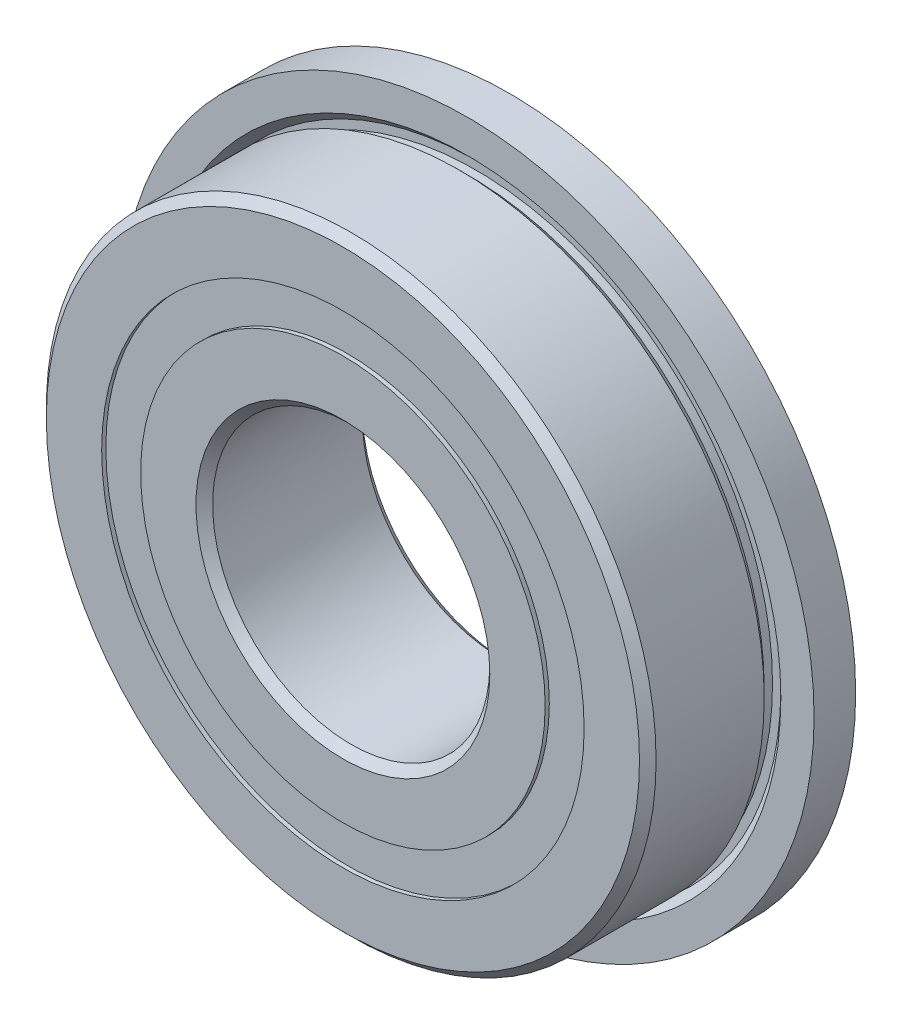
ISO-10303-21;
HEADER;
FILE_DESCRIPTION(('STEP AP214'),'2;1');
FILE_NAME('part.step','',(''),(''),'','','');
FILE_SCHEMA(('AUTOMOTIVE_DESIGN { 1 0 10303 214 1 1 1 1 }'));
ENDSEC;
DATA;
#1=APPLICATION_CONTEXT('core data for automotive mechanical design processes');
#2=APPLICATION_PROTOCOL_DEFINITION('international standard','automotive_design',2000,#1);
#3=PRODUCT_CONTEXT('',#1,'mechanical');
#4=PRODUCT('Part','Part','',(#3));
#5=PRODUCT_RELATED_PRODUCT_CATEGORY('part','',(#4));
#6=PRODUCT_DEFINITION_FORMATION('','',#4);
#7=PRODUCT_DEFINITION_CONTEXT('part definition',#1,'design');
#8=PRODUCT_DEFINITION('design','',#6,#7);
#9=PRODUCT_DEFINITION_SHAPE('','',#8);
#10=(LENGTH_UNIT() NAMED_UNIT(*) SI_UNIT(.MILLI.,.METRE.));
#11=(NAMED_UNIT(*) PLANE_ANGLE_UNIT() SI_UNIT($,.RADIAN.));
#12=(NAMED_UNIT(*) SI_UNIT($,.STERADIAN.) SOLID_ANGLE_UNIT());
#13=UNCERTAINTY_MEASURE_WITH_UNIT(LENGTH_MEASURE(1.E-05),#10,'distance_accuracy_value','');
#14=(GEOMETRIC_REPRESENTATION_CONTEXT(3) GLOBAL_UNCERTAINTY_ASSIGNED_CONTEXT((#13)) GLOBAL_UNIT_ASSIGNED_CONTEXT((#10,
#11,#12)) REPRESENTATION_CONTEXT('',''));
#15=CARTESIAN_POINT('',(0.,0.,0.));
#16=DIRECTION('',(0.,0.,1.));
#17=DIRECTION('',(1.,0.,0.));
#18=AXIS2_PLACEMENT_3D('',#15,#16,#17);
#19=CARTESIAN_POINT('',(0.,8.7032967032967,-2.85000000000001));
#20=DIRECTION('',(0.,0.,1.));
#21=DIRECTION('',(1.,0.,0.));
#22=AXIS2_PLACEMENT_3D('',#19,#20,#21);
#23=PLANE('',#22);
#24=CARTESIAN_POINT('',(0.,0.,-2.85000000000001));
#25=DIRECTION('',(0.,0.,1.));
#26=DIRECTION('',(1.,0.,0.));
#27=AXIS2_PLACEMENT_3D('',#24,#25,#26);
#28=CIRCLE('',#27,8.7032967032967);
#29=CARTESIAN_POINT('',(8.7032967032967,0.,-2.85000000000001));
#30=VERTEX_POINT('',#29);
#31=EDGE_CURVE('E55',#30,#30,#28,.T.);
#32=ORIENTED_EDGE('',*,*,#31,.F.);
#33=EDGE_LOOP('',(#32));
#34=FACE_BOUND('',#33,.T.);
#35=CARTESIAN_POINT('',(0.,0.,-2.85000000000001));
#36=DIRECTION('',(0.,0.,1.));
#37=DIRECTION('',(1.,0.,0.));
#38=AXIS2_PLACEMENT_3D('',#35,#36,#37);
#39=CIRCLE('',#38,7.2967032967033);
#40=CARTESIAN_POINT('',(7.2967032967033,0.,-2.85000000000001));
#41=VERTEX_POINT('',#40);
#42=EDGE_CURVE('E11',#41,#41,#39,.T.);
#43=ORIENTED_EDGE('',*,*,#42,.T.);
#44=EDGE_LOOP('',(#43));
#45=FACE_BOUND('',#44,.T.);
#46=ADVANCED_FACE('F41',(#34,#45),#23,.F.);
#47=CARTESIAN_POINT('',(0.,0.,3.));
#48=DIRECTION('',(0.,0.,1.));
#49=DIRECTION('',(1.,0.,0.));
#50=AXIS2_PLACEMENT_3D('',#47,#48,#49);
#51=CYLINDRICAL_SURFACE('',#50,7.2967032967033);
#52=ORIENTED_EDGE('',*,*,#42,.F.);
#53=EDGE_LOOP('',(#52));
#54=FACE_BOUND('',#53,.T.);
#55=CARTESIAN_POINT('',(0.,0.,-1.50744951180655));
#56=DIRECTION('',(0.,0.,1.));
#57=DIRECTION('',(1.,0.,0.));
#58=AXIS2_PLACEMENT_3D('',#55,#56,#57);
#59=CIRCLE('',#58,7.2967032967033);
#60=CARTESIAN_POINT('',(7.2967032967033,0.,-1.50744951180655));
#61=VERTEX_POINT('',#60);
#62=EDGE_CURVE('E47',#61,#61,#59,.T.);
#63=ORIENTED_EDGE('',*,*,#62,.T.);
#64=EDGE_LOOP('',(#63));
#65=FACE_BOUND('',#64,.T.);
#66=ADVANCED_FACE('F64',(#54,#65),#51,.F.);
#67=CARTESIAN_POINT('',(0.,8.7032967032967,-1.50744951180654));
#68=DIRECTION('',(0.,0.,-1.));
#69=DIRECTION('',(-1.,0.,0.));
#70=AXIS2_PLACEMENT_3D('',#67,#68,#69);
#71=PLANE('',#70);
#72=ORIENTED_EDGE('',*,*,#62,.F.);
#73=EDGE_LOOP('',(#72));
#74=FACE_BOUND('',#73,.T.);
#75=CARTESIAN_POINT('',(0.,0.,-1.50744951180654));
#76=DIRECTION('',(0.,0.,1.));
#77=DIRECTION('',(1.,0.,0.));
#78=AXIS2_PLACEMENT_3D('',#75,#76,#77);
#79=CIRCLE('',#78,8.7032967032967);
#80=CARTESIAN_POINT('',(8.7032967032967,0.,-1.50744951180654));
#81=VERTEX_POINT('',#80);
#82=EDGE_CURVE('E51',#81,#81,#79,.T.);
#83=ORIENTED_EDGE('',*,*,#82,.T.);
#84=EDGE_LOOP('',(#83));
#85=FACE_BOUND('',#84,.T.);
#86=ADVANCED_FACE('F68',(#74,#85),#71,.F.);
#87=CARTESIAN_POINT('',(0.,0.,3.));
#88=DIRECTION('',(0.,0.,1.));
#89=DIRECTION('',(1.,0.,0.));
#90=AXIS2_PLACEMENT_3D('',#87,#88,#89);
#91=CYLINDRICAL_SURFACE('',#90,8.7032967032967);
#92=ORIENTED_EDGE('',*,*,#82,.F.);
#93=EDGE_LOOP('',(#92));
#94=FACE_BOUND('',#93,.T.);
#95=ORIENTED_EDGE('',*,*,#31,.T.);
#96=EDGE_LOOP('',(#95));
#97=FACE_BOUND('',#96,.T.);
#98=ADVANCED_FACE('F61',(#94,#97),#91,.T.);
#99=CLOSED_SHELL('',(#46,#66,#86,#98));
#100=MANIFOLD_SOLID_BREP('B2',#99);
#101=CARTESIAN_POINT('',(0.,8.7032967032967,2.85000000000001));
#102=DIRECTION('',(0.,0.,-1.));
#103=DIRECTION('',(-1.,0.,0.));
#104=AXIS2_PLACEMENT_3D('',#101,#102,#103);
#105=PLANE('',#104);
#106=CARTESIAN_POINT('',(0.,0.,2.85000000000001));
#107=DIRECTION('',(0.,0.,1.));
#108=DIRECTION('',(1.,0.,0.));
#109=AXIS2_PLACEMENT_3D('',#106,#107,#108);
#110=CIRCLE('',#109,7.2967032967033);
#111=CARTESIAN_POINT('',(7.2967032967033,0.,2.85000000000001));
#112=VERTEX_POINT('',#111);
#113=EDGE_CURVE('E40',#112,#112,#110,.T.);
#114=ORIENTED_EDGE('',*,*,#113,.F.);
#115=EDGE_LOOP('',(#114));
#116=FACE_BOUND('',#115,.T.);
#117=CARTESIAN_POINT('',(0.,0.,2.85000000000001));
#118=DIRECTION('',(0.,0.,1.));
#119=DIRECTION('',(1.,0.,0.));
#120=AXIS2_PLACEMENT_3D('',#117,#118,#119);
#121=CIRCLE('',#120,8.7032967032967);
#122=CARTESIAN_POINT('',(8.7032967032967,0.,2.85000000000001));
#123=VERTEX_POINT('',#122);
#124=EDGE_CURVE('E122',#123,#123,#121,.T.);
#125=ORIENTED_EDGE('',*,*,#124,.T.);
#126=EDGE_LOOP('',(#125));
#127=FACE_BOUND('',#126,.T.);
#128=ADVANCED_FACE('F108',(#116,#127),#105,.F.);
#129=CARTESIAN_POINT('',(0.,0.,3.));
#130=DIRECTION('',(0.,0.,1.));
#131=DIRECTION('',(1.,0.,0.));
#132=AXIS2_PLACEMENT_3D('',#129,#130,#131);
#133=CYLINDRICAL_SURFACE('',#132,7.2967032967033);
#134=CARTESIAN_POINT('',(0.,0.,1.50744951180654));
#135=DIRECTION('',(0.,0.,1.));
#136=DIRECTION('',(1.,0.,0.));
#137=AXIS2_PLACEMENT_3D('',#134,#135,#136);
#138=CIRCLE('',#137,7.2967032967033);
#139=CARTESIAN_POINT('',(7.2967032967033,0.,1.50744951180654));
#140=VERTEX_POINT('',#139);
#141=EDGE_CURVE('E114',#140,#140,#138,.T.);
#142=ORIENTED_EDGE('',*,*,#141,.F.);
#143=EDGE_LOOP('',(#142));
#144=FACE_BOUND('',#143,.T.);
#145=ORIENTED_EDGE('',*,*,#113,.T.);
#146=EDGE_LOOP('',(#145));
#147=FACE_BOUND('',#146,.T.);
#148=ADVANCED_FACE('F137',(#144,#147),#133,.F.);
#149=CARTESIAN_POINT('',(0.,8.7032967032967,1.50744951180654));
#150=DIRECTION('',(0.,0.,1.));
#151=DIRECTION('',(1.,0.,0.));
#152=AXIS2_PLACEMENT_3D('',#149,#150,#151);
#153=PLANE('',#152);
#154=CARTESIAN_POINT('',(0.,0.,1.50744951180654));
#155=DIRECTION('',(0.,0.,1.));
#156=DIRECTION('',(1.,0.,0.));
#157=AXIS2_PLACEMENT_3D('',#154,#155,#156);
#158=CIRCLE('',#157,8.7032967032967);
#159=CARTESIAN_POINT('',(8.7032967032967,0.,1.50744951180654));
#160=VERTEX_POINT('',#159);
#161=EDGE_CURVE('E118',#160,#160,#158,.T.);
#162=ORIENTED_EDGE('',*,*,#161,.F.);
#163=EDGE_LOOP('',(#162));
#164=FACE_BOUND('',#163,.T.);
#165=ORIENTED_EDGE('',*,*,#141,.T.);
#166=EDGE_LOOP('',(#165));
#167=FACE_BOUND('',#166,.T.);
#168=ADVANCED_FACE('F132',(#164,#167),#153,.F.);
#169=CARTESIAN_POINT('',(0.,0.,3.));
#170=DIRECTION('',(0.,0.,1.));
#171=DIRECTION('',(1.,0.,0.));
#172=AXIS2_PLACEMENT_3D('',#169,#170,#171);
#173=CYLINDRICAL_SURFACE('',#172,8.7032967032967);
#174=ORIENTED_EDGE('',*,*,#124,.F.);
#175=EDGE_LOOP('',(#174));
#176=FACE_BOUND('',#175,.T.);
#177=ORIENTED_EDGE('',*,*,#161,.T.);
#178=EDGE_LOOP('',(#177));
#179=FACE_BOUND('',#178,.T.);
#180=ADVANCED_FACE('F129',(#176,#179),#173,.T.);
#181=CLOSED_SHELL('',(#128,#148,#168,#180));
#182=MANIFOLD_SOLID_BREP('B6',#181);
#183=CARTESIAN_POINT('',(0.,8.,0.));
#184=DIRECTION('',(0.,0.,1.));
#185=DIRECTION('',(0.,1.,0.));
#186=AXIS2_PLACEMENT_3D('',#183,#184,#185);
#187=SPHERICAL_SURFACE('',#186,1.50744951180654);
#188=CARTESIAN_POINT('',(0.,8.,1.50744951180654));
#189=VERTEX_POINT('',#188);
#190=VERTEX_LOOP('',#189);
#191=FACE_BOUND('',#190,.T.);
#192=ADVANCED_FACE('F177',(#191),#187,.T.);
#193=CLOSED_SHELL('',(#192));
#194=MANIFOLD_SOLID_BREP('B35',#193);
#195=CARTESIAN_POINT('',(0.,8.35164835164835,0.117216117216116));
#196=DIRECTION('',(0.,0.,-1.));
#197=DIRECTION('',(-1.,0.,0.));
#198=AXIS2_PLACEMENT_3D('',#195,#196,#197);
#199=PLANE('',#198);
#200=CARTESIAN_POINT('',(0.,0.,0.117216117216116));
#201=DIRECTION('',(0.,0.,1.));
#202=DIRECTION('',(1.,0.,0.));
#203=AXIS2_PLACEMENT_3D('',#200,#201,#202);
#204=CIRCLE('',#203,7.64835164835165);
#205=CARTESIAN_POINT('',(7.64835164835165,0.,0.117216117216116));
#206=VERTEX_POINT('',#205);
#207=EDGE_CURVE('E176',#206,#206,#204,.T.);
#208=ORIENTED_EDGE('',*,*,#207,.F.);
#209=EDGE_LOOP('',(#208));
#210=FACE_BOUND('',#209,.T.);
#211=CARTESIAN_POINT('',(0.,0.,0.117216117216116));
#212=DIRECTION('',(0.,0.,1.));
#213=DIRECTION('',(1.,0.,0.));
#214=AXIS2_PLACEMENT_3D('',#211,#212,#213);
#215=CIRCLE('',#214,8.35164835164835);
#216=CARTESIAN_POINT('',(8.35164835164835,0.,0.117216117216116));
#217=VERTEX_POINT('',#216);
#218=EDGE_CURVE('E211',#217,#217,#215,.T.);
#219=ORIENTED_EDGE('',*,*,#218,.T.);
#220=EDGE_LOOP('',(#219));
#221=FACE_BOUND('',#220,.T.);
#222=ADVANCED_FACE('F197',(#210,#221),#199,.F.);
#223=CARTESIAN_POINT('',(0.,0.,3.));
#224=DIRECTION('',(0.,0.,1.));
#225=DIRECTION('',(1.,0.,0.));
#226=AXIS2_PLACEMENT_3D('',#223,#224,#225);
#227=CYLINDRICAL_SURFACE('',#226,7.64835164835165);
#228=CARTESIAN_POINT('',(0.,0.,-0.117216117216118));
#229=DIRECTION('',(0.,0.,1.));
#230=DIRECTION('',(1.,0.,0.));
#231=AXIS2_PLACEMENT_3D('',#228,#229,#230);
#232=CIRCLE('',#231,7.64835164835165);
#233=CARTESIAN_POINT('',(7.64835164835165,0.,-0.117216117216118));
#234=VERTEX_POINT('',#233);
#235=EDGE_CURVE('E203',#234,#234,#232,.T.);
#236=ORIENTED_EDGE('',*,*,#235,.F.);
#237=EDGE_LOOP('',(#236));
#238=FACE_BOUND('',#237,.T.);
#239=ORIENTED_EDGE('',*,*,#207,.T.);
#240=EDGE_LOOP('',(#239));
#241=FACE_BOUND('',#240,.T.);
#242=ADVANCED_FACE('F226',(#238,#241),#227,.F.);
#243=CARTESIAN_POINT('',(0.,8.35164835164835,-0.117216117216118));
#244=DIRECTION('',(0.,0.,1.));
#245=DIRECTION('',(1.,0.,0.));
#246=AXIS2_PLACEMENT_3D('',#243,#244,#245);
#247=PLANE('',#246);
#248=CARTESIAN_POINT('',(0.,0.,-0.117216117216118));
#249=DIRECTION('',(0.,0.,1.));
#250=DIRECTION('',(1.,0.,0.));
#251=AXIS2_PLACEMENT_3D('',#248,#249,#250);
#252=CIRCLE('',#251,8.35164835164835);
#253=CARTESIAN_POINT('',(8.35164835164835,0.,-0.117216117216118));
#254=VERTEX_POINT('',#253);
#255=EDGE_CURVE('E207',#254,#254,#252,.T.);
#256=ORIENTED_EDGE('',*,*,#255,.F.);
#257=EDGE_LOOP('',(#256));
#258=FACE_BOUND('',#257,.T.);
#259=ORIENTED_EDGE('',*,*,#235,.T.);
#260=EDGE_LOOP('',(#259));
#261=FACE_BOUND('',#260,.T.);
#262=ADVANCED_FACE('F221',(#258,#261),#247,.F.);
#263=CARTESIAN_POINT('',(0.,0.,3.));
#264=DIRECTION('',(0.,0.,1.));
#265=DIRECTION('',(1.,0.,0.));
#266=AXIS2_PLACEMENT_3D('',#263,#264,#265);
#267=CYLINDRICAL_SURFACE('',#266,8.35164835164835);
#268=ORIENTED_EDGE('',*,*,#218,.F.);
#269=EDGE_LOOP('',(#268));
#270=FACE_BOUND('',#269,.T.);
#271=ORIENTED_EDGE('',*,*,#255,.T.);
#272=EDGE_LOOP('',(#271));
#273=FACE_BOUND('',#272,.T.);
#274=ADVANCED_FACE('F218',(#270,#273),#267,.T.);
#275=CLOSED_SHELL('',(#222,#242,#262,#274));
#276=MANIFOLD_SOLID_BREP('B104',#275);
#277=CARTESIAN_POINT('',(0.,7.2967032967033,3.));
#278=DIRECTION('',(0.,0.,-1.));
#279=DIRECTION('',(-1.,0.,0.));
#280=AXIS2_PLACEMENT_3D('',#277,#278,#279);
#281=PLANE('',#280);
#282=CARTESIAN_POINT('',(0.,0.,3.));
#283=DIRECTION('',(0.,0.,1.));
#284=DIRECTION('',(1.,0.,0.));
#285=AXIS2_PLACEMENT_3D('',#282,#283,#284);
#286=CIRCLE('',#285,5.29999999999998);
#287=CARTESIAN_POINT('',(5.29999999999998,0.,3.));
#288=VERTEX_POINT('',#287);
#289=EDGE_CURVE('E293',#288,#288,#286,.T.);
#290=ORIENTED_EDGE('',*,*,#289,.F.);
#291=EDGE_LOOP('',(#290));
#292=FACE_BOUND('',#291,.T.);
#293=CARTESIAN_POINT('',(0.,0.,3.));
#294=DIRECTION('',(0.,0.,1.));
#295=DIRECTION('',(1.,0.,0.));
#296=AXIS2_PLACEMENT_3D('',#293,#294,#295);
#297=CIRCLE('',#296,7.2967032967033);
#298=CARTESIAN_POINT('',(7.2967032967033,0.,3.));
#299=VERTEX_POINT('',#298);
#300=EDGE_CURVE('E196',#299,#299,#297,.T.);
#301=ORIENTED_EDGE('',*,*,#300,.T.);
#302=EDGE_LOOP('',(#301));
#303=FACE_BOUND('',#302,.T.);
#304=ADVANCED_FACE('F265',(#292,#303),#281,.F.);
#305=CARTESIAN_POINT('',(0.,0.,3.));
#306=DIRECTION('',(0.,0.,1.));
#307=DIRECTION('',(1.,0.,0.));
#308=AXIS2_PLACEMENT_3D('',#305,#306,#307);
#309=CYLINDRICAL_SURFACE('',#308,7.2967032967033);
#310=ORIENTED_EDGE('',*,*,#300,.F.);
#311=EDGE_LOOP('',(#310));
#312=FACE_BOUND('',#311,.T.);
#313=CARTESIAN_POINT('',(0.,0.,1.33333333333333));
#314=DIRECTION('',(0.,0.,1.));
#315=DIRECTION('',(1.,0.,0.));
#316=AXIS2_PLACEMENT_3D('',#313,#314,#315);
#317=CIRCLE('',#316,7.2967032967033);
#318=CARTESIAN_POINT('',(7.2967032967033,0.,1.33333333333333));
#319=VERTEX_POINT('',#318);
#320=EDGE_CURVE('E271',#319,#319,#317,.T.);
#321=ORIENTED_EDGE('',*,*,#320,.T.);
#322=EDGE_LOOP('',(#321));
#323=FACE_BOUND('',#322,.T.);
#324=ADVANCED_FACE('F300',(#312,#323),#309,.T.);
#325=CARTESIAN_POINT('',(0.,0.,0.));
#326=DIRECTION('',(0.,0.,1.));
#327=DIRECTION('',(1.,0.,0.));
#328=AXIS2_PLACEMENT_3D('',#325,#326,#327);
#329=TOROIDAL_SURFACE('',#328,8.,1.50744951180654);
#330=ORIENTED_EDGE('',*,*,#320,.F.);
#331=EDGE_LOOP('',(#330));
#332=FACE_BOUND('',#331,.T.);
#333=CARTESIAN_POINT('',(0.,0.,-1.33333333333333));
#334=DIRECTION('',(0.,0.,1.));
#335=DIRECTION('',(1.,0.,0.));
#336=AXIS2_PLACEMENT_3D('',#333,#334,#335);
#337=CIRCLE('',#336,7.2967032967033);
#338=CARTESIAN_POINT('',(7.2967032967033,0.,-1.33333333333333));
#339=VERTEX_POINT('',#338);
#340=EDGE_CURVE('E275',#339,#339,#337,.T.);
#341=ORIENTED_EDGE('',*,*,#340,.T.);
#342=EDGE_LOOP('',(#341));
#343=FACE_BOUND('',#342,.T.);
#344=ADVANCED_FACE('F304',(#332,#343),#329,.F.);
#345=CARTESIAN_POINT('',(0.,0.,3.));
#346=DIRECTION('',(0.,0.,1.));
#347=DIRECTION('',(1.,0.,0.));
#348=AXIS2_PLACEMENT_3D('',#345,#346,#347);
#349=CYLINDRICAL_SURFACE('',#348,7.2967032967033);
#350=ORIENTED_EDGE('',*,*,#340,.F.);
#351=EDGE_LOOP('',(#350));
#352=FACE_BOUND('',#351,.T.);
#353=CARTESIAN_POINT('',(0.,0.,-3.));
#354=DIRECTION('',(0.,0.,1.));
#355=DIRECTION('',(1.,0.,0.));
#356=AXIS2_PLACEMENT_3D('',#353,#354,#355);
#357=CIRCLE('',#356,7.2967032967033);
#358=CARTESIAN_POINT('',(7.2967032967033,0.,-3.));
#359=VERTEX_POINT('',#358);
#360=EDGE_CURVE('E279',#359,#359,#357,.T.);
#361=ORIENTED_EDGE('',*,*,#360,.T.);
#362=EDGE_LOOP('',(#361));
#363=FACE_BOUND('',#362,.T.);
#364=ADVANCED_FACE('F309',(#352,#363),#349,.T.);
#365=CARTESIAN_POINT('',(0.,5.29999999999998,-3.));
#366=DIRECTION('',(0.,0.,1.));
#367=DIRECTION('',(1.,0.,0.));
#368=AXIS2_PLACEMENT_3D('',#365,#366,#367);
#369=PLANE('',#368);
#370=ORIENTED_EDGE('',*,*,#360,.F.);
#371=EDGE_LOOP('',(#370));
#372=FACE_BOUND('',#371,.T.);
#373=CARTESIAN_POINT('',(0.,0.,-3.));
#374=DIRECTION('',(0.,0.,1.));
#375=DIRECTION('',(1.,0.,0.));
#376=AXIS2_PLACEMENT_3D('',#373,#374,#375);
#377=CIRCLE('',#376,5.29999999999998);
#378=CARTESIAN_POINT('',(5.29999999999998,0.,-3.));
#379=VERTEX_POINT('',#378);
#380=EDGE_CURVE('E284',#379,#379,#377,.T.);
#381=ORIENTED_EDGE('',*,*,#380,.T.);
#382=EDGE_LOOP('',(#381));
#383=FACE_BOUND('',#382,.T.);
#384=ADVANCED_FACE('F315',(#372,#383),#369,.F.);
#385=CARTESIAN_POINT('',(0.,0.,-2.70000000000002));
#386=DIRECTION('',(0.,0.,-1.));
#387=DIRECTION('',(-1.,0.,0.));
#388=AXIS2_PLACEMENT_3D('',#385,#386,#387);
#389=CONICAL_SURFACE('',#388,5.,0.785398163397453);
#390=ORIENTED_EDGE('',*,*,#380,.F.);
#391=EDGE_LOOP('',(#390));
#392=FACE_BOUND('',#391,.T.);
#393=CARTESIAN_POINT('',(0.,0.,-2.70000000000002));
#394=DIRECTION('',(0.,0.,1.));
#395=DIRECTION('',(1.,0.,0.));
#396=AXIS2_PLACEMENT_3D('',#393,#394,#395);
#397=CIRCLE('',#396,5.);
#398=CARTESIAN_POINT('',(5.,0.,-2.70000000000002));
#399=VERTEX_POINT('',#398);
#400=EDGE_CURVE('E287',#399,#399,#397,.T.);
#401=ORIENTED_EDGE('',*,*,#400,.T.);
#402=EDGE_LOOP('',(#401));
#403=FACE_BOUND('',#402,.T.);
#404=ADVANCED_FACE('F319',(#392,#403),#389,.F.);
#405=CARTESIAN_POINT('',(0.,0.,3.));
#406=DIRECTION('',(0.,0.,1.));
#407=DIRECTION('',(1.,0.,0.));
#408=AXIS2_PLACEMENT_3D('',#405,#406,#407);
#409=CYLINDRICAL_SURFACE('',#408,5.);
#410=ORIENTED_EDGE('',*,*,#400,.F.);
#411=EDGE_LOOP('',(#410));
#412=FACE_BOUND('',#411,.T.);
#413=CARTESIAN_POINT('',(0.,0.,2.70000000000002));
#414=DIRECTION('',(0.,0.,1.));
#415=DIRECTION('',(1.,0.,0.));
#416=AXIS2_PLACEMENT_3D('',#413,#414,#415);
#417=CIRCLE('',#416,5.);
#418=CARTESIAN_POINT('',(5.,0.,2.70000000000002));
#419=VERTEX_POINT('',#418);
#420=EDGE_CURVE('E290',#419,#419,#417,.T.);
#421=ORIENTED_EDGE('',*,*,#420,.T.);
#422=EDGE_LOOP('',(#421));
#423=FACE_BOUND('',#422,.T.);
#424=ADVANCED_FACE('F323',(#412,#423),#409,.F.);
#425=CARTESIAN_POINT('',(0.,0.,3.));
#426=DIRECTION('',(0.,0.,1.));
#427=DIRECTION('',(1.,0.,0.));
#428=AXIS2_PLACEMENT_3D('',#425,#426,#427);
#429=CONICAL_SURFACE('',#428,5.29999999999998,0.785398163397445);
#430=ORIENTED_EDGE('',*,*,#420,.F.);
#431=EDGE_LOOP('',(#430));
#432=FACE_BOUND('',#431,.T.);
#433=ORIENTED_EDGE('',*,*,#289,.T.);
#434=EDGE_LOOP('',(#433));
#435=FACE_BOUND('',#434,.T.);
#436=ADVANCED_FACE('F297',(#432,#435),#429,.F.);
#437=CLOSED_SHELL('',(#304,#324,#344,#364,#384,#404,#424,#436));
#438=MANIFOLD_SOLID_BREP('B171',#437);
#439=CARTESIAN_POINT('',(0.,0.,3.));
#440=DIRECTION('',(0.,0.,1.));
#441=DIRECTION('',(1.,0.,0.));
#442=AXIS2_PLACEMENT_3D('',#439,#440,#441);
#443=CYLINDRICAL_SURFACE('',#442,12.5);
#444=CARTESIAN_POINT('',(0.,0.,-1.5));
#445=DIRECTION('',(0.,0.,1.));
#446=DIRECTION('',(1.,0.,0.));
#447=AXIS2_PLACEMENT_3D('',#444,#445,#446);
#448=CIRCLE('',#447,12.5);
#449=CARTESIAN_POINT('',(12.5,0.,-1.5));
#450=VERTEX_POINT('',#449);
#451=EDGE_CURVE('E392',#450,#450,#448,.T.);
#452=ORIENTED_EDGE('',*,*,#451,.F.);
#453=EDGE_LOOP('',(#452));
#454=FACE_BOUND('',#453,.T.);
#455=CARTESIAN_POINT('',(0.,0.,-2.99999999999999));
#456=DIRECTION('',(0.,0.,1.));
#457=DIRECTION('',(1.,0.,0.));
#458=AXIS2_PLACEMENT_3D('',#455,#456,#457);
#459=CIRCLE('',#458,12.5);
#460=CARTESIAN_POINT('',(12.5,0.,-2.99999999999999));
#461=VERTEX_POINT('',#460);
#462=EDGE_CURVE('E264',#461,#461,#459,.T.);
#463=ORIENTED_EDGE('',*,*,#462,.T.);
#464=EDGE_LOOP('',(#463));
#465=FACE_BOUND('',#464,.T.);
#466=ADVANCED_FACE('F386',(#454,#465),#443,.T.);
#467=CARTESIAN_POINT('',(0.,12.5,-1.5));
#468=DIRECTION('',(0.,0.,-1.));
#469=DIRECTION('',(-1.,0.,0.));
#470=AXIS2_PLACEMENT_3D('',#467,#468,#469);
#471=PLANE('',#470);
#472=CARTESIAN_POINT('',(0.,0.,-1.5));
#473=DIRECTION('',(0.,0.,1.));
#474=DIRECTION('',(1.,0.,0.));
#475=AXIS2_PLACEMENT_3D('',#472,#473,#474);
#476=CIRCLE('',#475,11.3);
#477=CARTESIAN_POINT('',(11.3,0.,-1.5));
#478=VERTEX_POINT('',#477);
#479=EDGE_CURVE('E396',#478,#478,#476,.T.);
#480=ORIENTED_EDGE('',*,*,#479,.F.);
#481=EDGE_LOOP('',(#480));
#482=FACE_BOUND('',#481,.T.);
#483=ORIENTED_EDGE('',*,*,#451,.T.);
#484=EDGE_LOOP('',(#483));
#485=FACE_BOUND('',#484,.T.);
#486=ADVANCED_FACE('F492',(#482,#485),#471,.F.);
#487=CARTESIAN_POINT('',(0.,0.,-1.5));
#488=DIRECTION('',(0.,0.,1.));
#489=DIRECTION('',(1.,0.,0.));
#490=AXIS2_PLACEMENT_3D('',#487,#488,#489);
#491=CONICAL_SURFACE('',#490,11.3,0.785398163397437);
#492=CARTESIAN_POINT('',(0.,0.,-1.79999999999998));
#493=DIRECTION('',(0.,0.,1.));
#494=DIRECTION('',(1.,0.,0.));
#495=AXIS2_PLACEMENT_3D('',#492,#493,#494);
#496=CIRCLE('',#495,11.);
#497=CARTESIAN_POINT('',(11.,0.,-1.79999999999998));
#498=VERTEX_POINT('',#497);
#499=EDGE_CURVE('E400',#498,#498,#496,.T.);
#500=ORIENTED_EDGE('',*,*,#499,.F.);
#501=EDGE_LOOP('',(#500));
#502=FACE_BOUND('',#501,.T.);
#503=ORIENTED_EDGE('',*,*,#479,.T.);
#504=EDGE_LOOP('',(#503));
#505=FACE_BOUND('',#504,.T.);
#506=ADVANCED_FACE('F486',(#502,#505),#491,.F.);
#507=CARTESIAN_POINT('',(0.,11.,-1.79999999999998));
#508=DIRECTION('',(0.,0.,-1.));
#509=DIRECTION('',(-1.,0.,0.));
#510=AXIS2_PLACEMENT_3D('',#507,#508,#509);
#511=PLANE('',#510);
#512=CARTESIAN_POINT('',(0.,0.,-1.79999999999998));
#513=DIRECTION('',(0.,0.,1.));
#514=DIRECTION('',(1.,0.,0.));
#515=AXIS2_PLACEMENT_3D('',#512,#513,#514);
#516=CIRCLE('',#515,10.7);
#517=CARTESIAN_POINT('',(10.7,0.,-1.79999999999998));
#518=VERTEX_POINT('',#517);
#519=EDGE_CURVE('E405',#518,#518,#516,.T.);
#520=ORIENTED_EDGE('',*,*,#519,.F.);
#521=EDGE_LOOP('',(#520));
#522=FACE_BOUND('',#521,.T.);
#523=ORIENTED_EDGE('',*,*,#499,.T.);
#524=EDGE_LOOP('',(#523));
#525=FACE_BOUND('',#524,.T.);
#526=ADVANCED_FACE('F480',(#522,#525),#511,.F.);
#527=CARTESIAN_POINT('',(0.,0.,3.));
#528=DIRECTION('',(0.,0.,1.));
#529=DIRECTION('',(1.,0.,0.));
#530=AXIS2_PLACEMENT_3D('',#527,#528,#529);
#531=CYLINDRICAL_SURFACE('',#530,10.7);
#532=CARTESIAN_POINT('',(0.,0.,-1.5));
#533=DIRECTION('',(0.,0.,1.));
#534=DIRECTION('',(1.,0.,0.));
#535=AXIS2_PLACEMENT_3D('',#532,#533,#534);
#536=CIRCLE('',#535,10.7);
#537=CARTESIAN_POINT('',(10.7,0.,-1.5));
#538=VERTEX_POINT('',#537);
#539=EDGE_CURVE('E408',#538,#538,#536,.T.);
#540=ORIENTED_EDGE('',*,*,#539,.F.);
#541=EDGE_LOOP('',(#540));
#542=FACE_BOUND('',#541,.T.);
#543=ORIENTED_EDGE('',*,*,#519,.T.);
#544=EDGE_LOOP('',(#543));
#545=FACE_BOUND('',#544,.T.);
#546=ADVANCED_FACE('F474',(#542,#545),#531,.T.);
#547=CARTESIAN_POINT('',(0.,0.,-1.5));
#548=DIRECTION('',(0.,0.,1.));
#549=DIRECTION('',(1.,0.,0.));
#550=AXIS2_PLACEMENT_3D('',#547,#548,#549);
#551=CONICAL_SURFACE('',#550,10.7,0.785398163397447);
#552=CARTESIAN_POINT('',(0.,0.,-1.20000000000002));
#553=DIRECTION('',(0.,0.,1.));
#554=DIRECTION('',(1.,0.,0.));
#555=AXIS2_PLACEMENT_3D('',#552,#553,#554);
#556=CIRCLE('',#555,11.);
#557=CARTESIAN_POINT('',(11.,0.,-1.20000000000002));
#558=VERTEX_POINT('',#557);
#559=EDGE_CURVE('E411',#558,#558,#556,.T.);
#560=ORIENTED_EDGE('',*,*,#559,.F.);
#561=EDGE_LOOP('',(#560));
#562=FACE_BOUND('',#561,.T.);
#563=ORIENTED_EDGE('',*,*,#539,.T.);
#564=EDGE_LOOP('',(#563));
#565=FACE_BOUND('',#564,.T.);
#566=ADVANCED_FACE('F468',(#562,#565),#551,.T.);
#567=CARTESIAN_POINT('',(0.,0.,3.));
#568=DIRECTION('',(0.,0.,1.));
#569=DIRECTION('',(1.,0.,0.));
#570=AXIS2_PLACEMENT_3D('',#567,#568,#569);
#571=CYLINDRICAL_SURFACE('',#570,11.);
#572=CARTESIAN_POINT('',(0.,0.,2.70000000000002));
#573=DIRECTION('',(0.,0.,1.));
#574=DIRECTION('',(1.,0.,0.));
#575=AXIS2_PLACEMENT_3D('',#572,#573,#574);
#576=CIRCLE('',#575,11.);
#577=CARTESIAN_POINT('',(11.,0.,2.70000000000002));
#578=VERTEX_POINT('',#577);
#579=EDGE_CURVE('E414',#578,#578,#576,.T.);
#580=ORIENTED_EDGE('',*,*,#579,.F.);
#581=EDGE_LOOP('',(#580));
#582=FACE_BOUND('',#581,.T.);
#583=ORIENTED_EDGE('',*,*,#559,.T.);
#584=EDGE_LOOP('',(#583));
#585=FACE_BOUND('',#584,.T.);
#586=ADVANCED_FACE('F462',(#582,#585),#571,.T.);
#587=CARTESIAN_POINT('',(0.,0.,2.70000000000002));
#588=DIRECTION('',(0.,0.,-1.));
#589=DIRECTION('',(-1.,0.,0.));
#590=AXIS2_PLACEMENT_3D('',#587,#588,#589);
#591=CONICAL_SURFACE('',#590,11.,0.785398163397453);
#592=CARTESIAN_POINT('',(0.,0.,3.));
#593=DIRECTION('',(0.,0.,1.));
#594=DIRECTION('',(1.,0.,0.));
#595=AXIS2_PLACEMENT_3D('',#592,#593,#594);
#596=CIRCLE('',#595,10.7);
#597=CARTESIAN_POINT('',(10.7,0.,3.));
#598=VERTEX_POINT('',#597);
#599=EDGE_CURVE('E417',#598,#598,#596,.T.);
#600=ORIENTED_EDGE('',*,*,#599,.F.);
#601=EDGE_LOOP('',(#600));
#602=FACE_BOUND('',#601,.T.);
#603=ORIENTED_EDGE('',*,*,#579,.T.);
#604=EDGE_LOOP('',(#603));
#605=FACE_BOUND('',#604,.T.);
#606=ADVANCED_FACE('F456',(#602,#605),#591,.T.);
#607=CARTESIAN_POINT('',(0.,10.7,3.));
#608=DIRECTION('',(0.,0.,-1.));
#609=DIRECTION('',(-1.,0.,0.));
#610=AXIS2_PLACEMENT_3D('',#607,#608,#609);
#611=PLANE('',#610);
#612=CARTESIAN_POINT('',(0.,0.,3.));
#613=DIRECTION('',(0.,0.,1.));
#614=DIRECTION('',(1.,0.,0.));
#615=AXIS2_PLACEMENT_3D('',#612,#613,#614);
#616=CIRCLE('',#615,8.7032967032967);
#617=CARTESIAN_POINT('',(8.7032967032967,0.,3.));
#618=VERTEX_POINT('',#617);
#619=EDGE_CURVE('E420',#618,#618,#616,.T.);
#620=ORIENTED_EDGE('',*,*,#619,.F.);
#621=EDGE_LOOP('',(#620));
#622=FACE_BOUND('',#621,.T.);
#623=ORIENTED_EDGE('',*,*,#599,.T.);
#624=EDGE_LOOP('',(#623));
#625=FACE_BOUND('',#624,.T.);
#626=ADVANCED_FACE('F450',(#622,#625),#611,.F.);
#627=CARTESIAN_POINT('',(0.,0.,3.));
#628=DIRECTION('',(0.,0.,1.));
#629=DIRECTION('',(1.,0.,0.));
#630=AXIS2_PLACEMENT_3D('',#627,#628,#629);
#631=CYLINDRICAL_SURFACE('',#630,8.7032967032967);
#632=CARTESIAN_POINT('',(0.,0.,1.33333333333333));
#633=DIRECTION('',(0.,0.,1.));
#634=DIRECTION('',(1.,0.,0.));
#635=AXIS2_PLACEMENT_3D('',#632,#633,#634);
#636=CIRCLE('',#635,8.7032967032967);
#637=CARTESIAN_POINT('',(8.7032967032967,0.,1.33333333333333));
#638=VERTEX_POINT('',#637);
#639=EDGE_CURVE('E423',#638,#638,#636,.T.);
#640=ORIENTED_EDGE('',*,*,#639,.F.);
#641=EDGE_LOOP('',(#640));
#642=FACE_BOUND('',#641,.T.);
#643=ORIENTED_EDGE('',*,*,#619,.T.);
#644=EDGE_LOOP('',(#643));
#645=FACE_BOUND('',#644,.T.);
#646=ADVANCED_FACE('F444',(#642,#645),#631,.F.);
#647=CARTESIAN_POINT('',(0.,0.,0.));
#648=DIRECTION('',(0.,0.,1.));
#649=DIRECTION('',(1.,0.,0.));
#650=AXIS2_PLACEMENT_3D('',#647,#648,#649);
#651=TOROIDAL_SURFACE('',#650,8.,1.50744951180654);
#652=CARTESIAN_POINT('',(0.,0.,-1.33333333333333));
#653=DIRECTION('',(0.,0.,1.));
#654=DIRECTION('',(1.,0.,0.));
#655=AXIS2_PLACEMENT_3D('',#652,#653,#654);
#656=CIRCLE('',#655,8.7032967032967);
#657=CARTESIAN_POINT('',(8.7032967032967,0.,-1.33333333333333));
#658=VERTEX_POINT('',#657);
#659=EDGE_CURVE('E426',#658,#658,#656,.T.);
#660=ORIENTED_EDGE('',*,*,#659,.F.);
#661=EDGE_LOOP('',(#660));
#662=FACE_BOUND('',#661,.T.);
#663=ORIENTED_EDGE('',*,*,#639,.T.);
#664=EDGE_LOOP('',(#663));
#665=FACE_BOUND('',#664,.T.);
#666=ADVANCED_FACE('F438',(#662,#665),#651,.F.);
#667=CARTESIAN_POINT('',(0.,0.,3.));
#668=DIRECTION('',(0.,0.,1.));
#669=DIRECTION('',(1.,0.,0.));
#670=AXIS2_PLACEMENT_3D('',#667,#668,#669);
#671=CYLINDRICAL_SURFACE('',#670,8.7032967032967);
#672=CARTESIAN_POINT('',(0.,0.,-3.));
#673=DIRECTION('',(0.,0.,1.));
#674=DIRECTION('',(1.,0.,0.));
#675=AXIS2_PLACEMENT_3D('',#672,#673,#674);
#676=CIRCLE('',#675,8.7032967032967);
#677=CARTESIAN_POINT('',(8.7032967032967,0.,-3.));
#678=VERTEX_POINT('',#677);
#679=EDGE_CURVE('E429',#678,#678,#676,.T.);
#680=ORIENTED_EDGE('',*,*,#679,.F.);
#681=EDGE_LOOP('',(#680));
#682=FACE_BOUND('',#681,.T.);
#683=ORIENTED_EDGE('',*,*,#659,.T.);
#684=EDGE_LOOP('',(#683));
#685=FACE_BOUND('',#684,.T.);
#686=ADVANCED_FACE('F435',(#682,#685),#671,.F.);
#687=CARTESIAN_POINT('',(0.,8.7032967032967,-3.));
#688=DIRECTION('',(0.,0.,1.));
#689=DIRECTION('',(1.,0.,0.));
#690=AXIS2_PLACEMENT_3D('',#687,#688,#689);
#691=PLANE('',#690);
#692=ORIENTED_EDGE('',*,*,#462,.F.);
#693=EDGE_LOOP('',(#692));
#694=FACE_BOUND('',#693,.T.);
#695=ORIENTED_EDGE('',*,*,#679,.T.);
#696=EDGE_LOOP('',(#695));
#697=FACE_BOUND('',#696,.T.);
#698=ADVANCED_FACE('F433',(#694,#697),#691,.F.);
#699=CLOSED_SHELL('',(#466,#486,#506,#526,#546,#566,#586,#606,#626,#646,#666,#686,#698));
#700=MANIFOLD_SOLID_BREP('B191',#699);
#701=ADVANCED_BREP_SHAPE_REPRESENTATION('',(#18,#100,#182,#194,#276,#438,#700),#14);
#702=SHAPE_DEFINITION_REPRESENTATION(#9,#701);
ENDSEC;
END-ISO-10303-21;
